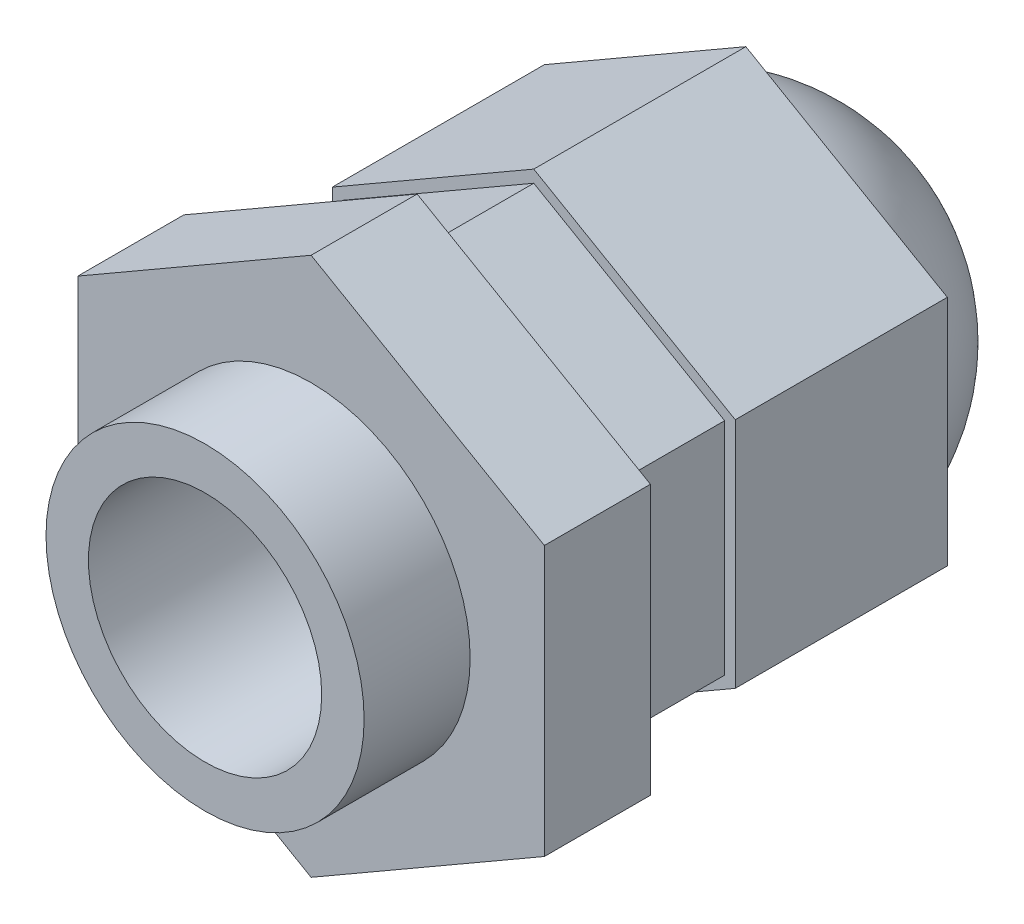
ISO-10303-21;
HEADER;
FILE_DESCRIPTION(('STEP AP214'),'2;1');
FILE_NAME('part.step','',(''),(''),'','','');
FILE_SCHEMA(('AUTOMOTIVE_DESIGN { 1 0 10303 214 1 1 1 1 }'));
ENDSEC;
DATA;
#1=APPLICATION_CONTEXT('core data for automotive mechanical design processes');
#2=APPLICATION_PROTOCOL_DEFINITION('international standard','automotive_design',2000,#1);
#3=PRODUCT_CONTEXT('',#1,'mechanical');
#4=PRODUCT('Part','Part','',(#3));
#5=PRODUCT_RELATED_PRODUCT_CATEGORY('part','',(#4));
#6=PRODUCT_DEFINITION_FORMATION('','',#4);
#7=PRODUCT_DEFINITION_CONTEXT('part definition',#1,'design');
#8=PRODUCT_DEFINITION('design','',#6,#7);
#9=PRODUCT_DEFINITION_SHAPE('','',#8);
#10=(LENGTH_UNIT() NAMED_UNIT(*) SI_UNIT(.MILLI.,.METRE.));
#11=(NAMED_UNIT(*) PLANE_ANGLE_UNIT() SI_UNIT($,.RADIAN.));
#12=(NAMED_UNIT(*) SI_UNIT($,.STERADIAN.) SOLID_ANGLE_UNIT());
#13=UNCERTAINTY_MEASURE_WITH_UNIT(LENGTH_MEASURE(1.E-05),#10,'distance_accuracy_value','');
#14=(GEOMETRIC_REPRESENTATION_CONTEXT(3) GLOBAL_UNCERTAINTY_ASSIGNED_CONTEXT((#13)) GLOBAL_UNIT_ASSIGNED_CONTEXT((#10,
#11,#12)) REPRESENTATION_CONTEXT('',''));
#15=CARTESIAN_POINT('',(0.,0.,0.));
#16=DIRECTION('',(0.,0.,1.));
#17=DIRECTION('',(1.,0.,0.));
#18=AXIS2_PLACEMENT_3D('',#15,#16,#17);
#19=CARTESIAN_POINT('',(0.,0.,-23.3142857142857));
#20=DIRECTION('',(0.,0.,1.));
#21=DIRECTION('',(1.,0.,0.));
#22=AXIS2_PLACEMENT_3D('',#19,#20,#21);
#23=SPHERICAL_SURFACE('',#22,9.28571428571428);
#24=CARTESIAN_POINT('',(0.,0.,-25.6));
#25=DIRECTION('',(0.,0.,-1.));
#26=DIRECTION('',(-1.,0.,0.));
#27=AXIS2_PLACEMENT_3D('',#24,#25,#26);
#28=CIRCLE('',#27,9.);
#29=CARTESIAN_POINT('',(9.,0.,-25.6));
#30=VERTEX_POINT('',#29);
#31=EDGE_CURVE('E151',#30,#30,#28,.T.);
#32=CARTESIAN_POINT('',(0.,0.,-31.));
#33=DIRECTION('',(0.,0.,-1.));
#34=DIRECTION('',(-1.,0.,0.));
#35=AXIS2_PLACEMENT_3D('',#32,#33,#34);
#36=CIRCLE('',#35,5.21097742408138);
#37=CARTESIAN_POINT('',(5.21097742408138,0.,-31.));
#38=VERTEX_POINT('',#37);
#39=EDGE_CURVE('E313',#38,#38,#36,.F.);
#40=CARTESIAN_POINT('',(9.,0.,-25.6));
#41=CARTESIAN_POINT('',(8.98270792926875,0.,-25.6680881274408));
#42=CARTESIAN_POINT('',(8.96464291467511,0.,-25.7359799456978));
#43=CARTESIAN_POINT('',(8.92697692679167,0.,-25.8713361672399));
#44=CARTESIAN_POINT('',(8.90737595350187,0.,-25.9388005705249));
#45=CARTESIAN_POINT('',(8.86664797725476,0.,-26.0732671655184));
#46=CARTESIAN_POINT('',(8.84552097429744,0.,-26.1402693572269));
#47=CARTESIAN_POINT('',(8.80175186577183,0.,-26.273777029533));
#48=CARTESIAN_POINT('',(8.77910976020353,0.,-26.3402825101306));
#49=CARTESIAN_POINT('',(8.73232209712088,0.,-26.4727625007238));
#50=CARTESIAN_POINT('',(8.70817653960652,0.,-26.5387370107194));
#51=CARTESIAN_POINT('',(8.65839441292628,0.,-26.6701210783492));
#52=CARTESIAN_POINT('',(8.6327578437604,0.,-26.7355306359834));
#53=CARTESIAN_POINT('',(8.5800068979951,0.,-26.8657511069961));
#54=CARTESIAN_POINT('',(8.55289252139569,0.,-26.9305620203746));
#55=CARTESIAN_POINT('',(8.49719992727441,0.,-27.05955181964));
#56=CARTESIAN_POINT('',(8.46862170975255,0.,-27.1237307055269));
#57=CARTESIAN_POINT('',(8.41001615401102,0.,-27.2514233920412));
#58=CARTESIAN_POINT('',(8.37998881579135,0.,-27.3149371926687));
#59=CARTESIAN_POINT('',(8.31850048538145,0.,-27.4412669934953));
#60=CARTESIAN_POINT('',(8.28703949319123,0.,-27.5040829936944));
#61=CARTESIAN_POINT('',(8.22270006000389,0.,-27.6289848379181));
#62=CARTESIAN_POINT('',(8.18982161900678,0.,-27.6910706819426));
#63=CARTESIAN_POINT('',(8.12266422348532,0.,-27.8144802341667));
#64=CARTESIAN_POINT('',(8.08838526896097,0.,-27.8758039423663));
#65=CARTESIAN_POINT('',(8.01844450305039,0.,-27.9976576358565));
#66=CARTESIAN_POINT('',(7.98278269166416,0.,-28.0581876211472));
#67=CARTESIAN_POINT('',(7.91009458098803,0.,-28.1784226905725));
#68=CARTESIAN_POINT('',(7.87306828169814,0.,-28.2381277747072));
#69=CARTESIAN_POINT('',(7.79767026700366,0.,-28.3566822884698));
#70=CARTESIAN_POINT('',(7.75929855159907,0.,-28.4155317180978));
#71=CARTESIAN_POINT('',(7.6812294694714,0.,-28.5323446102336));
#72=CARTESIAN_POINT('',(7.64153210274833,0.,-28.5903080727413));
#73=CARTESIAN_POINT('',(7.56083216560647,0.,-28.7053191743736));
#74=CARTESIAN_POINT('',(7.51982959518769,0.,-28.7623668134982));
#75=CARTESIAN_POINT('',(7.43654037057153,0.,-28.8755168838305));
#76=CARTESIAN_POINT('',(7.39425371637415,0.,-28.9316193150383));
#77=CARTESIAN_POINT('',(7.30841810553353,0.,-29.0428500718684));
#78=CARTESIAN_POINT('',(7.26486914889031,0.,-29.0979783974907));
#79=CARTESIAN_POINT('',(7.17653136468716,0.,-29.2072325472309));
#80=CARTESIAN_POINT('',(7.13174253712725,0.,-29.2613583713488));
#81=CARTESIAN_POINT('',(7.04094808126202,0.,-29.3685796385373));
#82=CARTESIAN_POINT('',(6.9949424529567,0.,-29.4216750816079));
#83=CARTESIAN_POINT('',(6.90173809253119,0.,-29.5268082378957));
#84=CARTESIAN_POINT('',(6.85453936041101,0.,-29.578845951113));
#85=CARTESIAN_POINT('',(6.75897310383843,0.,-29.6818368437106));
#86=CARTESIAN_POINT('',(6.71060557938603,0.,-29.7327900230909));
#87=CARTESIAN_POINT('',(6.61272665166556,0.,-29.8335856026654));
#88=CARTESIAN_POINT('',(6.56321524839748,0.,-29.8834280028597));
#89=CARTESIAN_POINT('',(6.46307406574734,0.,-29.9819763508441));
#90=CARTESIAN_POINT('',(6.41244428636529,0.,-30.0306822986343));
#91=CARTESIAN_POINT('',(6.31009243029785,0.,-30.1269326540312));
#92=CARTESIAN_POINT('',(6.25837035361246,0.,-30.174477061638));
#93=CARTESIAN_POINT('',(6.15386054420159,0.,-30.2683798469365));
#94=CARTESIAN_POINT('',(6.10107281147612,0.,-30.3147382246281));
#95=CARTESIAN_POINT('',(5.99445888081226,0.,-30.4062450721979));
#96=CARTESIAN_POINT('',(5.94063268287387,0.,-30.451393542076));
#97=CARTESIAN_POINT('',(5.83196954505749,0.,-30.5404573158799));
#98=CARTESIAN_POINT('',(5.77713260517948,0.,-30.5843726198058));
#99=CARTESIAN_POINT('',(5.66647623653807,0.,-30.6709474516267));
#100=CARTESIAN_POINT('',(5.61065680777467,0.,-30.7136069795217));
#101=CARTESIAN_POINT('',(5.498064186298,0.,-30.7976482479995));
#102=CARTESIAN_POINT('',(5.44129099358474,0.,-30.8390299885822));
#103=CARTESIAN_POINT('',(5.32682018800191,0.,-30.9204945086053));
#104=CARTESIAN_POINT('',(5.26912257513233,0.,-30.9605772880457));
#105=CARTESIAN_POINT('',(5.21097742408138,0.,-31.));
#106=B_SPLINE_CURVE_WITH_KNOTS('',3,(#40,#41,#42,#43,#44,#45,#46,#47,#48,#49,#50,#51,#52,#53,
#54,#55,#56,#57,#58,#59,#60,#61,#62,#63,#64,#65,#66,#67,#68,#69,#70,#71,#72,#73,#74,#75,#76,#77,
#78,#79,#80,#81,#82,#83,#84,#85,#86,#87,#88,#89,#90,#91,#92,#93,#94,#95,#96,#97,#98,#99,#100,
#101,#102,#103,#104,#105),.UNSPECIFIED.,.F.,.F.,(4,2,2,2,2,2,2,2,2,2,2,2,2,2,2,2,2,2,2,2,2,2,2,
2,2,2,2,2,2,2,2,2,4),(0.,0.210744320577327,0.421488641154651,0.632232961731976,
0.842977282309298,1.05372160288662,1.26446592346395,1.47521024404127,1.6859545646186,
1.89669888519592,2.10744320577325,2.31818752635057,2.52893184692789,2.73967616750522,
2.95042048808254,3.16116480865987,3.37190912923719,3.58265344981452,3.79339777039184,
4.00414209096917,4.21488641154649,4.42563073212381,4.63637505270114,4.84711937327846,
5.05786369385579,5.26860801443311,5.47935233501044,5.69009665558776,5.90084097616509,
6.11158529674241,6.32232961731973,6.53307393789706,6.74381825847439),.UNSPECIFIED.);
#107=EDGE_CURVE('BSEAM35',#30,#38,#106,.T.);
#108=ORIENTED_EDGE('',*,*,#31,.T.);
#109=ORIENTED_EDGE('',*,*,#39,.T.);
#110=ORIENTED_EDGE('',*,*,#107,.T.);
#111=ORIENTED_EDGE('',*,*,#107,.F.);
#112=EDGE_LOOP('',(#108,#110,#109,#111));
#113=FACE_BOUND('',#112,.T.);
#114=ADVANCED_FACE('F35',(#113),#23,.T.);
#115=CARTESIAN_POINT('',(0.,0.,-44.5));
#116=DIRECTION('',(0.,0.,1.));
#117=DIRECTION('',(1.,0.,0.));
#118=AXIS2_PLACEMENT_3D('',#115,#116,#117);
#119=CYLINDRICAL_SURFACE('',#118,4.);
#120=CARTESIAN_POINT('',(0.,0.,-24.5));
#121=DIRECTION('',(0.,0.,1.));
#122=DIRECTION('',(1.,0.,0.));
#123=AXIS2_PLACEMENT_3D('',#120,#121,#122);
#124=CIRCLE('',#123,4.);
#125=CARTESIAN_POINT('',(4.,0.,-24.5));
#126=VERTEX_POINT('',#125);
#127=EDGE_CURVE('E166',#126,#126,#124,.T.);
#128=ORIENTED_EDGE('',*,*,#127,.T.);
#129=EDGE_LOOP('',(#128));
#130=FACE_BOUND('',#129,.T.);
#131=CARTESIAN_POINT('',(0.,0.,-31.));
#132=DIRECTION('',(0.,0.,-1.));
#133=DIRECTION('',(-1.,0.,0.));
#134=AXIS2_PLACEMENT_3D('',#131,#132,#133);
#135=CIRCLE('',#134,4.);
#136=CARTESIAN_POINT('',(-4.,0.,-31.));
#137=VERTEX_POINT('',#136);
#138=EDGE_CURVE('E38',#137,#137,#135,.F.);
#139=ORIENTED_EDGE('',*,*,#138,.F.);
#140=EDGE_LOOP('',(#139));
#141=FACE_BOUND('',#140,.T.);
#142=ADVANCED_FACE('F303',(#130,#141),#119,.F.);
#143=CARTESIAN_POINT('',(-9.5,5.48482755730145,-25.5));
#144=DIRECTION('',(0.,0.,1.));
#145=DIRECTION('',(1.,0.,0.));
#146=AXIS2_PLACEMENT_3D('',#143,#144,#145);
#147=PLANE('',#146);
#148=DIRECTION('',(0.866025403784439,0.5,0.));
#149=VECTOR('',#148,1.);
#150=CARTESIAN_POINT('',(-9.5,5.48482755730145,-25.5));
#151=LINE('',#150,#149);
#152=CARTESIAN_POINT('',(-9.5,5.48482755730145,-25.5));
#153=VERTEX_POINT('',#152);
#154=CARTESIAN_POINT('',(0.,10.9696551146029,-25.5));
#155=VERTEX_POINT('',#154);
#156=EDGE_CURVE('E170',#153,#155,#151,.T.);
#157=ORIENTED_EDGE('',*,*,#156,.T.);
#158=DIRECTION('',(0.866025403784439,-0.5,0.));
#159=VECTOR('',#158,1.);
#160=CARTESIAN_POINT('',(0.,10.9696551146029,-25.5));
#161=LINE('',#160,#159);
#162=CARTESIAN_POINT('',(9.5,5.48482755730145,-25.5));
#163=VERTEX_POINT('',#162);
#164=EDGE_CURVE('E173',#155,#163,#161,.T.);
#165=ORIENTED_EDGE('',*,*,#164,.T.);
#166=DIRECTION('',(0.,-1.,0.));
#167=VECTOR('',#166,1.);
#168=CARTESIAN_POINT('',(9.5,5.48482755730145,-25.5));
#169=LINE('',#168,#167);
#170=CARTESIAN_POINT('',(9.5,-5.48482755730145,-25.5));
#171=VERTEX_POINT('',#170);
#172=EDGE_CURVE('E177',#163,#171,#169,.T.);
#173=ORIENTED_EDGE('',*,*,#172,.T.);
#174=DIRECTION('',(-0.866025403784439,-0.5,0.));
#175=VECTOR('',#174,1.);
#176=CARTESIAN_POINT('',(9.5,-5.48482755730145,-25.5));
#177=LINE('',#176,#175);
#178=CARTESIAN_POINT('',(0.,-10.9696551146029,-25.5));
#179=VERTEX_POINT('',#178);
#180=EDGE_CURVE('E180',#171,#179,#177,.T.);
#181=ORIENTED_EDGE('',*,*,#180,.T.);
#182=DIRECTION('',(-0.866025403784439,0.5,0.));
#183=VECTOR('',#182,1.);
#184=CARTESIAN_POINT('',(0.,-10.9696551146029,-25.5));
#185=LINE('',#184,#183);
#186=CARTESIAN_POINT('',(-9.5,-5.48482755730145,-25.5));
#187=VERTEX_POINT('',#186);
#188=EDGE_CURVE('E183',#179,#187,#185,.T.);
#189=ORIENTED_EDGE('',*,*,#188,.T.);
#190=DIRECTION('',(0.,1.,0.));
#191=VECTOR('',#190,1.);
#192=CARTESIAN_POINT('',(-9.5,-5.48482755730145,-25.5));
#193=LINE('',#192,#191);
#194=EDGE_CURVE('E186',#187,#153,#193,.T.);
#195=ORIENTED_EDGE('',*,*,#194,.T.);
#196=EDGE_LOOP('',(#157,#165,#173,#181,#189,#195));
#197=FACE_BOUND('',#196,.T.);
#198=CARTESIAN_POINT('',(0.,0.,-25.5));
#199=DIRECTION('',(0.,0.,1.));
#200=DIRECTION('',(1.,0.,0.));
#201=AXIS2_PLACEMENT_3D('',#198,#199,#200);
#202=CIRCLE('',#201,9.);
#203=CARTESIAN_POINT('',(9.,0.,-25.5));
#204=VERTEX_POINT('',#203);
#205=EDGE_CURVE('E12',#204,#204,#202,.F.);
#206=ORIENTED_EDGE('',*,*,#205,.F.);
#207=EDGE_LOOP('',(#206));
#208=FACE_BOUND('',#207,.T.);
#209=ADVANCED_FACE('F307',(#197,#208),#147,.F.);
#210=CARTESIAN_POINT('',(11.,19.0525588832577,-10.));
#211=DIRECTION('',(0.,0.,-1.));
#212=DIRECTION('',(-1.,0.,0.));
#213=AXIS2_PLACEMENT_3D('',#210,#211,#212);
#214=PLANE('',#213);
#215=DIRECTION('',(0.866025403784439,0.5,0.));
#216=VECTOR('',#215,1.);
#217=CARTESIAN_POINT('',(-11.,6.35085296108589,-10.));
#218=LINE('',#217,#216);
#219=CARTESIAN_POINT('',(-11.,6.35085296108589,-10.));
#220=VERTEX_POINT('',#219);
#221=CARTESIAN_POINT('',(0.,12.7017059221718,-10.));
#222=VERTEX_POINT('',#221);
#223=EDGE_CURVE('E138',#220,#222,#218,.T.);
#224=ORIENTED_EDGE('',*,*,#223,.T.);
#225=DIRECTION('',(0.866025403784439,-0.5,0.));
#226=VECTOR('',#225,1.);
#227=CARTESIAN_POINT('',(0.,12.7017059221718,-10.));
#228=LINE('',#227,#226);
#229=CARTESIAN_POINT('',(11.,6.35085296108589,-10.));
#230=VERTEX_POINT('',#229);
#231=EDGE_CURVE('E92',#222,#230,#228,.T.);
#232=ORIENTED_EDGE('',*,*,#231,.T.);
#233=DIRECTION('',(0.,-1.,0.));
#234=VECTOR('',#233,1.);
#235=CARTESIAN_POINT('',(11.,6.35085296108589,-10.));
#236=LINE('',#235,#234);
#237=CARTESIAN_POINT('',(11.,-6.35085296108588,-10.));
#238=VERTEX_POINT('',#237);
#239=EDGE_CURVE('E109',#230,#238,#236,.T.);
#240=ORIENTED_EDGE('',*,*,#239,.T.);
#241=DIRECTION('',(-0.866025403784439,-0.5,0.));
#242=VECTOR('',#241,1.);
#243=CARTESIAN_POINT('',(11.,-6.35085296108588,-10.));
#244=LINE('',#243,#242);
#245=CARTESIAN_POINT('',(0.,-12.7017059221718,-10.));
#246=VERTEX_POINT('',#245);
#247=EDGE_CURVE('E102',#238,#246,#244,.T.);
#248=ORIENTED_EDGE('',*,*,#247,.T.);
#249=DIRECTION('',(-0.866025403784439,0.5,0.));
#250=VECTOR('',#249,1.);
#251=CARTESIAN_POINT('',(0.,-12.7017059221718,-10.));
#252=LINE('',#251,#250);
#253=CARTESIAN_POINT('',(-11.,-6.35085296108589,-10.));
#254=VERTEX_POINT('',#253);
#255=EDGE_CURVE('E107',#246,#254,#252,.T.);
#256=ORIENTED_EDGE('',*,*,#255,.T.);
#257=DIRECTION('',(0.,1.,0.));
#258=VECTOR('',#257,1.);
#259=CARTESIAN_POINT('',(-11.,-6.35085296108589,-10.));
#260=LINE('',#259,#258);
#261=EDGE_CURVE('E53',#254,#220,#260,.T.);
#262=ORIENTED_EDGE('',*,*,#261,.T.);
#263=EDGE_LOOP('',(#224,#232,#240,#248,#256,#262));
#264=FACE_BOUND('',#263,.T.);
#265=CARTESIAN_POINT('',(0.,0.,-10.));
#266=DIRECTION('',(0.,0.,-1.));
#267=DIRECTION('',(-1.,0.,0.));
#268=AXIS2_PLACEMENT_3D('',#265,#266,#267);
#269=CIRCLE('',#268,7.5);
#270=CARTESIAN_POINT('',(-7.5,0.,-10.));
#271=VERTEX_POINT('',#270);
#272=EDGE_CURVE('E274',#271,#271,#269,.T.);
#273=ORIENTED_EDGE('',*,*,#272,.F.);
#274=EDGE_LOOP('',(#273));
#275=FACE_BOUND('',#274,.T.);
#276=ADVANCED_FACE('F104',(#264,#275),#214,.T.);
#277=CARTESIAN_POINT('',(0.,0.,-5.));
#278=DIRECTION('',(0.,0.,1.));
#279=DIRECTION('',(1.,0.,0.));
#280=AXIS2_PLACEMENT_3D('',#277,#278,#279);
#281=CYLINDRICAL_SURFACE('',#280,7.5);
#282=CARTESIAN_POINT('',(0.,0.,-5.));
#283=DIRECTION('',(0.,0.,-1.));
#284=DIRECTION('',(-1.,0.,0.));
#285=AXIS2_PLACEMENT_3D('',#282,#283,#284);
#286=CIRCLE('',#285,7.5);
#287=CARTESIAN_POINT('',(-7.5,0.,-5.));
#288=VERTEX_POINT('',#287);
#289=EDGE_CURVE('E147',#288,#288,#286,.F.);
#290=ORIENTED_EDGE('',*,*,#289,.T.);
#291=EDGE_LOOP('',(#290));
#292=FACE_BOUND('',#291,.T.);
#293=CARTESIAN_POINT('',(0.,0.,0.));
#294=DIRECTION('',(0.,0.,1.));
#295=DIRECTION('',(1.,0.,0.));
#296=AXIS2_PLACEMENT_3D('',#293,#294,#295);
#297=CIRCLE('',#296,7.5);
#298=CARTESIAN_POINT('',(7.5,0.,0.));
#299=VERTEX_POINT('',#298);
#300=EDGE_CURVE('E44',#299,#299,#297,.T.);
#301=ORIENTED_EDGE('',*,*,#300,.F.);
#302=EDGE_LOOP('',(#301));
#303=FACE_BOUND('',#302,.T.);
#304=ADVANCED_FACE('F401',(#292,#303),#281,.T.);
#305=CARTESIAN_POINT('',(0.,0.,0.));
#306=DIRECTION('',(0.,0.,1.));
#307=DIRECTION('',(1.,0.,0.));
#308=AXIS2_PLACEMENT_3D('',#305,#306,#307);
#309=PLANE('',#308);
#310=CARTESIAN_POINT('',(0.,0.,0.));
#311=DIRECTION('',(0.,0.,1.));
#312=DIRECTION('',(1.,0.,0.));
#313=AXIS2_PLACEMENT_3D('',#310,#311,#312);
#314=CIRCLE('',#313,5.5);
#315=CARTESIAN_POINT('',(5.5,0.,0.));
#316=VERTEX_POINT('',#315);
#317=EDGE_CURVE('E161',#316,#316,#314,.T.);
#318=ORIENTED_EDGE('',*,*,#317,.F.);
#319=EDGE_LOOP('',(#318));
#320=FACE_BOUND('',#319,.T.);
#321=ORIENTED_EDGE('',*,*,#300,.T.);
#322=EDGE_LOOP('',(#321));
#323=FACE_BOUND('',#322,.T.);
#324=ADVANCED_FACE('F405',(#320,#323),#309,.T.);
#325=CARTESIAN_POINT('',(-11.,6.35085296108589,-10.));
#326=DIRECTION('',(0.5,-0.866025403784439,0.));
#327=DIRECTION('',(0.866025403784439,0.5,0.));
#328=AXIS2_PLACEMENT_3D('',#325,#326,#327);
#329=PLANE('',#328);
#330=DIRECTION('',(0.866025403784439,0.5,0.));
#331=VECTOR('',#330,1.);
#332=CARTESIAN_POINT('',(-11.,6.35085296108589,-5.));
#333=LINE('',#332,#331);
#334=CARTESIAN_POINT('',(-11.,6.35085296108589,-5.));
#335=VERTEX_POINT('',#334);
#336=CARTESIAN_POINT('',(0.,12.7017059221718,-5.));
#337=VERTEX_POINT('',#336);
#338=EDGE_CURVE('E127',#335,#337,#333,.T.);
#339=ORIENTED_EDGE('',*,*,#338,.T.);
#340=DIRECTION('',(0.,0.,1.));
#341=VECTOR('',#340,1.);
#342=CARTESIAN_POINT('',(0.,12.7017059221718,-10.));
#343=LINE('',#342,#341);
#344=EDGE_CURVE('E145',#222,#337,#343,.T.);
#345=ORIENTED_EDGE('',*,*,#344,.F.);
#346=ORIENTED_EDGE('',*,*,#223,.F.);
#347=DIRECTION('',(0.,0.,1.));
#348=VECTOR('',#347,1.);
#349=CARTESIAN_POINT('',(-11.,6.35085296108589,-10.));
#350=LINE('',#349,#348);
#351=EDGE_CURVE('E123',#220,#335,#350,.T.);
#352=ORIENTED_EDGE('',*,*,#351,.T.);
#353=EDGE_LOOP('',(#339,#345,#346,#352));
#354=FACE_BOUND('',#353,.T.);
#355=ADVANCED_FACE('F290',(#354),#329,.F.);
#356=CARTESIAN_POINT('',(0.,12.7017059221718,-10.));
#357=DIRECTION('',(-0.5,-0.866025403784439,0.));
#358=DIRECTION('',(0.866025403784439,-0.5,0.));
#359=AXIS2_PLACEMENT_3D('',#356,#357,#358);
#360=PLANE('',#359);
#361=DIRECTION('',(0.866025403784439,-0.5,0.));
#362=VECTOR('',#361,1.);
#363=CARTESIAN_POINT('',(0.,12.7017059221718,-5.));
#364=LINE('',#363,#362);
#365=CARTESIAN_POINT('',(11.,6.35085296108589,-5.));
#366=VERTEX_POINT('',#365);
#367=EDGE_CURVE('E130',#337,#366,#364,.T.);
#368=ORIENTED_EDGE('',*,*,#367,.T.);
#369=DIRECTION('',(0.,0.,1.));
#370=VECTOR('',#369,1.);
#371=CARTESIAN_POINT('',(11.,6.35085296108589,-10.));
#372=LINE('',#371,#370);
#373=EDGE_CURVE('E142',#230,#366,#372,.T.);
#374=ORIENTED_EDGE('',*,*,#373,.F.);
#375=ORIENTED_EDGE('',*,*,#231,.F.);
#376=ORIENTED_EDGE('',*,*,#344,.T.);
#377=EDGE_LOOP('',(#368,#374,#375,#376));
#378=FACE_BOUND('',#377,.T.);
#379=ADVANCED_FACE('F282',(#378),#360,.F.);
#380=CARTESIAN_POINT('',(11.,6.35085296108589,-10.));
#381=DIRECTION('',(-1.,0.,0.));
#382=DIRECTION('',(0.,0.,1.));
#383=AXIS2_PLACEMENT_3D('',#380,#381,#382);
#384=PLANE('',#383);
#385=DIRECTION('',(0.,-1.,0.));
#386=VECTOR('',#385,1.);
#387=CARTESIAN_POINT('',(11.,6.35085296108589,-5.));
#388=LINE('',#387,#386);
#389=CARTESIAN_POINT('',(11.,-6.35085296108588,-5.));
#390=VERTEX_POINT('',#389);
#391=EDGE_CURVE('E133',#366,#390,#388,.T.);
#392=ORIENTED_EDGE('',*,*,#391,.T.);
#393=DIRECTION('',(0.,0.,1.));
#394=VECTOR('',#393,1.);
#395=CARTESIAN_POINT('',(11.,-6.35085296108588,-10.));
#396=LINE('',#395,#394);
#397=EDGE_CURVE('E118',#238,#390,#396,.T.);
#398=ORIENTED_EDGE('',*,*,#397,.F.);
#399=ORIENTED_EDGE('',*,*,#239,.F.);
#400=ORIENTED_EDGE('',*,*,#373,.T.);
#401=EDGE_LOOP('',(#392,#398,#399,#400));
#402=FACE_BOUND('',#401,.T.);
#403=ADVANCED_FACE('F285',(#402),#384,.F.);
#404=CARTESIAN_POINT('',(11.,-6.35085296108588,-10.));
#405=DIRECTION('',(-0.5,0.866025403784439,0.));
#406=DIRECTION('',(-0.866025403784439,-0.5,0.));
#407=AXIS2_PLACEMENT_3D('',#404,#405,#406);
#408=PLANE('',#407);
#409=DIRECTION('',(-0.866025403784439,-0.5,0.));
#410=VECTOR('',#409,1.);
#411=CARTESIAN_POINT('',(11.,-6.35085296108588,-5.));
#412=LINE('',#411,#410);
#413=CARTESIAN_POINT('',(0.,-12.7017059221718,-5.));
#414=VERTEX_POINT('',#413);
#415=EDGE_CURVE('E117',#390,#414,#412,.T.);
#416=ORIENTED_EDGE('',*,*,#415,.T.);
#417=DIRECTION('',(0.,0.,1.));
#418=VECTOR('',#417,1.);
#419=CARTESIAN_POINT('',(0.,-12.7017059221718,-10.));
#420=LINE('',#419,#418);
#421=EDGE_CURVE('E114',#246,#414,#420,.T.);
#422=ORIENTED_EDGE('',*,*,#421,.F.);
#423=ORIENTED_EDGE('',*,*,#247,.F.);
#424=ORIENTED_EDGE('',*,*,#397,.T.);
#425=EDGE_LOOP('',(#416,#422,#423,#424));
#426=FACE_BOUND('',#425,.T.);
#427=ADVANCED_FACE('F115',(#426),#408,.F.);
#428=CARTESIAN_POINT('',(0.,-12.7017059221718,-10.));
#429=DIRECTION('',(0.5,0.866025403784439,0.));
#430=DIRECTION('',(-0.866025403784439,0.5,0.));
#431=AXIS2_PLACEMENT_3D('',#428,#429,#430);
#432=PLANE('',#431);
#433=DIRECTION('',(-0.866025403784439,0.5,0.));
#434=VECTOR('',#433,1.);
#435=CARTESIAN_POINT('',(0.,-12.7017059221718,-5.));
#436=LINE('',#435,#434);
#437=CARTESIAN_POINT('',(-11.,-6.35085296108589,-5.));
#438=VERTEX_POINT('',#437);
#439=EDGE_CURVE('E77',#414,#438,#436,.T.);
#440=ORIENTED_EDGE('',*,*,#439,.T.);
#441=DIRECTION('',(0.,0.,1.));
#442=VECTOR('',#441,1.);
#443=CARTESIAN_POINT('',(-11.,-6.35085296108589,-10.));
#444=LINE('',#443,#442);
#445=EDGE_CURVE('E119',#254,#438,#444,.T.);
#446=ORIENTED_EDGE('',*,*,#445,.F.);
#447=ORIENTED_EDGE('',*,*,#255,.F.);
#448=ORIENTED_EDGE('',*,*,#421,.T.);
#449=EDGE_LOOP('',(#440,#446,#447,#448));
#450=FACE_BOUND('',#449,.T.);
#451=ADVANCED_FACE('F121',(#450),#432,.F.);
#452=CARTESIAN_POINT('',(-11.,-6.35085296108589,-10.));
#453=DIRECTION('',(1.,0.,0.));
#454=DIRECTION('',(0.,1.,0.));
#455=AXIS2_PLACEMENT_3D('',#452,#453,#454);
#456=PLANE('',#455);
#457=DIRECTION('',(0.,1.,0.));
#458=VECTOR('',#457,1.);
#459=CARTESIAN_POINT('',(-11.,-6.35085296108589,-5.));
#460=LINE('',#459,#458);
#461=EDGE_CURVE('E83',#438,#335,#460,.T.);
#462=ORIENTED_EDGE('',*,*,#461,.T.);
#463=ORIENTED_EDGE('',*,*,#351,.F.);
#464=ORIENTED_EDGE('',*,*,#261,.F.);
#465=ORIENTED_EDGE('',*,*,#445,.T.);
#466=EDGE_LOOP('',(#462,#463,#464,#465));
#467=FACE_BOUND('',#466,.T.);
#468=ADVANCED_FACE('F291',(#467),#456,.F.);
#469=CARTESIAN_POINT('',(11.,19.0525588832577,-5.));
#470=DIRECTION('',(0.,0.,-1.));
#471=DIRECTION('',(-1.,0.,0.));
#472=AXIS2_PLACEMENT_3D('',#469,#470,#471);
#473=PLANE('',#472);
#474=ORIENTED_EDGE('',*,*,#289,.F.);
#475=EDGE_LOOP('',(#474));
#476=FACE_BOUND('',#475,.T.);
#477=ORIENTED_EDGE('',*,*,#338,.F.);
#478=ORIENTED_EDGE('',*,*,#461,.F.);
#479=ORIENTED_EDGE('',*,*,#439,.F.);
#480=ORIENTED_EDGE('',*,*,#415,.F.);
#481=ORIENTED_EDGE('',*,*,#391,.F.);
#482=ORIENTED_EDGE('',*,*,#367,.F.);
#483=EDGE_LOOP('',(#477,#478,#479,#480,#481,#482));
#484=FACE_BOUND('',#483,.T.);
#485=ADVANCED_FACE('F288',(#476,#484),#473,.F.);
#486=CARTESIAN_POINT('',(0.,0.,-11.));
#487=DIRECTION('',(0.,0.,1.));
#488=DIRECTION('',(1.,0.,0.));
#489=AXIS2_PLACEMENT_3D('',#486,#487,#488);
#490=CYLINDRICAL_SURFACE('',#489,7.5);
#491=CARTESIAN_POINT('',(0.,0.,-11.));
#492=DIRECTION('',(0.,0.,-1.));
#493=DIRECTION('',(-1.,0.,0.));
#494=AXIS2_PLACEMENT_3D('',#491,#492,#493);
#495=CIRCLE('',#494,7.5);
#496=CARTESIAN_POINT('',(-7.5,0.,-11.));
#497=VERTEX_POINT('',#496);
#498=EDGE_CURVE('E131',#497,#497,#495,.T.);
#499=ORIENTED_EDGE('',*,*,#498,.F.);
#500=EDGE_LOOP('',(#499));
#501=FACE_BOUND('',#500,.T.);
#502=ORIENTED_EDGE('',*,*,#272,.T.);
#503=EDGE_LOOP('',(#502));
#504=FACE_BOUND('',#503,.T.);
#505=ADVANCED_FACE('F298',(#501,#504),#490,.T.);
#506=CARTESIAN_POINT('',(9.,15.5884572681199,-11.));
#507=DIRECTION('',(0.,0.,-1.));
#508=DIRECTION('',(-1.,0.,0.));
#509=AXIS2_PLACEMENT_3D('',#506,#507,#508);
#510=PLANE('',#509);
#511=DIRECTION('',(0.866025403784439,0.5,0.));
#512=VECTOR('',#511,1.);
#513=CARTESIAN_POINT('',(-9.,5.19615242270664,-11.));
#514=LINE('',#513,#512);
#515=CARTESIAN_POINT('',(-9.,5.19615242270664,-11.));
#516=VERTEX_POINT('',#515);
#517=CARTESIAN_POINT('',(0.,10.3923048454133,-11.));
#518=VERTEX_POINT('',#517);
#519=EDGE_CURVE('E220',#516,#518,#514,.T.);
#520=ORIENTED_EDGE('',*,*,#519,.F.);
#521=DIRECTION('',(0.,1.,0.));
#522=VECTOR('',#521,1.);
#523=CARTESIAN_POINT('',(-9.,-5.19615242270663,-11.));
#524=LINE('',#523,#522);
#525=CARTESIAN_POINT('',(-9.,-5.19615242270663,-11.));
#526=VERTEX_POINT('',#525);
#527=EDGE_CURVE('E225',#526,#516,#524,.T.);
#528=ORIENTED_EDGE('',*,*,#527,.F.);
#529=DIRECTION('',(-0.866025403784439,0.5,0.));
#530=VECTOR('',#529,1.);
#531=CARTESIAN_POINT('',(0.,-10.3923048454133,-11.));
#532=LINE('',#531,#530);
#533=CARTESIAN_POINT('',(0.,-10.3923048454133,-11.));
#534=VERTEX_POINT('',#533);
#535=EDGE_CURVE('E252',#534,#526,#532,.T.);
#536=ORIENTED_EDGE('',*,*,#535,.F.);
#537=DIRECTION('',(-0.866025403784438,-0.5,0.));
#538=VECTOR('',#537,1.);
#539=CARTESIAN_POINT('',(9.,-5.19615242270663,-11.));
#540=LINE('',#539,#538);
#541=CARTESIAN_POINT('',(9.,-5.19615242270663,-11.));
#542=VERTEX_POINT('',#541);
#543=EDGE_CURVE('E249',#542,#534,#540,.T.);
#544=ORIENTED_EDGE('',*,*,#543,.F.);
#545=DIRECTION('',(0.,-1.,0.));
#546=VECTOR('',#545,1.);
#547=CARTESIAN_POINT('',(9.,5.19615242270664,-11.));
#548=LINE('',#547,#546);
#549=CARTESIAN_POINT('',(9.,5.19615242270664,-11.));
#550=VERTEX_POINT('',#549);
#551=EDGE_CURVE('E246',#550,#542,#548,.T.);
#552=ORIENTED_EDGE('',*,*,#551,.F.);
#553=DIRECTION('',(0.866025403784439,-0.5,0.));
#554=VECTOR('',#553,1.);
#555=CARTESIAN_POINT('',(0.,10.3923048454133,-11.));
#556=LINE('',#555,#554);
#557=EDGE_CURVE('E243',#518,#550,#556,.T.);
#558=ORIENTED_EDGE('',*,*,#557,.F.);
#559=EDGE_LOOP('',(#520,#528,#536,#544,#552,#558));
#560=FACE_BOUND('',#559,.T.);
#561=ORIENTED_EDGE('',*,*,#498,.T.);
#562=EDGE_LOOP('',(#561));
#563=FACE_BOUND('',#562,.T.);
#564=ADVANCED_FACE('F370',(#560,#563),#510,.F.);
#565=CARTESIAN_POINT('',(-9.,5.19615242270664,-15.5));
#566=DIRECTION('',(0.5,-0.866025403784439,0.));
#567=DIRECTION('',(0.866025403784439,0.5,0.));
#568=AXIS2_PLACEMENT_3D('',#565,#566,#567);
#569=PLANE('',#568);
#570=ORIENTED_EDGE('',*,*,#519,.T.);
#571=DIRECTION('',(0.,0.,1.));
#572=VECTOR('',#571,1.);
#573=CARTESIAN_POINT('',(0.,10.3923048454133,-15.5));
#574=LINE('',#573,#572);
#575=CARTESIAN_POINT('',(0.,10.3923048454133,-15.5));
#576=VERTEX_POINT('',#575);
#577=EDGE_CURVE('E271',#576,#518,#574,.T.);
#578=ORIENTED_EDGE('',*,*,#577,.F.);
#579=DIRECTION('',(0.866025403784439,0.5,0.));
#580=VECTOR('',#579,1.);
#581=CARTESIAN_POINT('',(-9.,5.19615242270664,-15.5));
#582=LINE('',#581,#580);
#583=CARTESIAN_POINT('',(-9.,5.19615242270664,-15.5));
#584=VERTEX_POINT('',#583);
#585=EDGE_CURVE('E221',#584,#576,#582,.T.);
#586=ORIENTED_EDGE('',*,*,#585,.F.);
#587=DIRECTION('',(0.,0.,1.));
#588=VECTOR('',#587,1.);
#589=CARTESIAN_POINT('',(-9.,5.19615242270664,-15.5));
#590=LINE('',#589,#588);
#591=EDGE_CURVE('E240',#584,#516,#590,.T.);
#592=ORIENTED_EDGE('',*,*,#591,.T.);
#593=EDGE_LOOP('',(#570,#578,#586,#592));
#594=FACE_BOUND('',#593,.T.);
#595=ADVANCED_FACE('F373',(#594),#569,.F.);
#596=CARTESIAN_POINT('',(0.,10.3923048454133,-15.5));
#597=DIRECTION('',(-0.5,-0.866025403784439,0.));
#598=DIRECTION('',(0.866025403784439,-0.5,0.));
#599=AXIS2_PLACEMENT_3D('',#596,#597,#598);
#600=PLANE('',#599);
#601=ORIENTED_EDGE('',*,*,#557,.T.);
#602=DIRECTION('',(0.,0.,1.));
#603=VECTOR('',#602,1.);
#604=CARTESIAN_POINT('',(9.,5.19615242270664,-15.5));
#605=LINE('',#604,#603);
#606=CARTESIAN_POINT('',(9.,5.19615242270664,-15.5));
#607=VERTEX_POINT('',#606);
#608=EDGE_CURVE('E268',#607,#550,#605,.T.);
#609=ORIENTED_EDGE('',*,*,#608,.F.);
#610=DIRECTION('',(0.866025403784439,-0.5,0.));
#611=VECTOR('',#610,1.);
#612=CARTESIAN_POINT('',(0.,10.3923048454133,-15.5));
#613=LINE('',#612,#611);
#614=EDGE_CURVE('E224',#576,#607,#613,.T.);
#615=ORIENTED_EDGE('',*,*,#614,.F.);
#616=ORIENTED_EDGE('',*,*,#577,.T.);
#617=EDGE_LOOP('',(#601,#609,#615,#616));
#618=FACE_BOUND('',#617,.T.);
#619=ADVANCED_FACE('F389',(#618),#600,.F.);
#620=CARTESIAN_POINT('',(9.,5.19615242270664,-15.5));
#621=DIRECTION('',(-1.,0.,0.));
#622=DIRECTION('',(0.,0.,1.));
#623=AXIS2_PLACEMENT_3D('',#620,#621,#622);
#624=PLANE('',#623);
#625=ORIENTED_EDGE('',*,*,#551,.T.);
#626=DIRECTION('',(0.,0.,1.));
#627=VECTOR('',#626,1.);
#628=CARTESIAN_POINT('',(9.,-5.19615242270663,-15.5));
#629=LINE('',#628,#627);
#630=CARTESIAN_POINT('',(9.,-5.19615242270663,-15.5));
#631=VERTEX_POINT('',#630);
#632=EDGE_CURVE('E265',#631,#542,#629,.T.);
#633=ORIENTED_EDGE('',*,*,#632,.F.);
#634=DIRECTION('',(0.,-1.,0.));
#635=VECTOR('',#634,1.);
#636=CARTESIAN_POINT('',(9.,5.19615242270664,-15.5));
#637=LINE('',#636,#635);
#638=EDGE_CURVE('E228',#607,#631,#637,.T.);
#639=ORIENTED_EDGE('',*,*,#638,.F.);
#640=ORIENTED_EDGE('',*,*,#608,.T.);
#641=EDGE_LOOP('',(#625,#633,#639,#640));
#642=FACE_BOUND('',#641,.T.);
#643=ADVANCED_FACE('F385',(#642),#624,.F.);
#644=CARTESIAN_POINT('',(9.,-5.19615242270663,-15.5));
#645=DIRECTION('',(-0.5,0.866025403784439,0.));
#646=DIRECTION('',(-0.866025403784439,-0.5,0.));
#647=AXIS2_PLACEMENT_3D('',#644,#645,#646);
#648=PLANE('',#647);
#649=ORIENTED_EDGE('',*,*,#543,.T.);
#650=DIRECTION('',(0.,0.,1.));
#651=VECTOR('',#650,1.);
#652=CARTESIAN_POINT('',(0.,-10.3923048454133,-15.5));
#653=LINE('',#652,#651);
#654=CARTESIAN_POINT('',(0.,-10.3923048454133,-15.5));
#655=VERTEX_POINT('',#654);
#656=EDGE_CURVE('E262',#655,#534,#653,.T.);
#657=ORIENTED_EDGE('',*,*,#656,.F.);
#658=DIRECTION('',(-0.866025403784438,-0.5,0.));
#659=VECTOR('',#658,1.);
#660=CARTESIAN_POINT('',(9.,-5.19615242270663,-15.5));
#661=LINE('',#660,#659);
#662=EDGE_CURVE('E231',#631,#655,#661,.T.);
#663=ORIENTED_EDGE('',*,*,#662,.F.);
#664=ORIENTED_EDGE('',*,*,#632,.T.);
#665=EDGE_LOOP('',(#649,#657,#663,#664));
#666=FACE_BOUND('',#665,.T.);
#667=ADVANCED_FACE('F381',(#666),#648,.F.);
#668=CARTESIAN_POINT('',(0.,-10.3923048454133,-15.5));
#669=DIRECTION('',(0.5,0.866025403784439,0.));
#670=DIRECTION('',(-0.866025403784439,0.5,0.));
#671=AXIS2_PLACEMENT_3D('',#668,#669,#670);
#672=PLANE('',#671);
#673=ORIENTED_EDGE('',*,*,#535,.T.);
#674=DIRECTION('',(0.,0.,1.));
#675=VECTOR('',#674,1.);
#676=CARTESIAN_POINT('',(-9.,-5.19615242270663,-15.5));
#677=LINE('',#676,#675);
#678=CARTESIAN_POINT('',(-9.,-5.19615242270663,-15.5));
#679=VERTEX_POINT('',#678);
#680=EDGE_CURVE('E259',#679,#526,#677,.T.);
#681=ORIENTED_EDGE('',*,*,#680,.F.);
#682=DIRECTION('',(-0.866025403784439,0.5,0.));
#683=VECTOR('',#682,1.);
#684=CARTESIAN_POINT('',(0.,-10.3923048454133,-15.5));
#685=LINE('',#684,#683);
#686=EDGE_CURVE('E234',#655,#679,#685,.T.);
#687=ORIENTED_EDGE('',*,*,#686,.F.);
#688=ORIENTED_EDGE('',*,*,#656,.T.);
#689=EDGE_LOOP('',(#673,#681,#687,#688));
#690=FACE_BOUND('',#689,.T.);
#691=ADVANCED_FACE('F377',(#690),#672,.F.);
#692=CARTESIAN_POINT('',(-9.,-5.19615242270663,-15.5));
#693=DIRECTION('',(1.,0.,0.));
#694=DIRECTION('',(0.,0.,-1.));
#695=AXIS2_PLACEMENT_3D('',#692,#693,#694);
#696=PLANE('',#695);
#697=ORIENTED_EDGE('',*,*,#527,.T.);
#698=ORIENTED_EDGE('',*,*,#591,.F.);
#699=DIRECTION('',(0.,1.,0.));
#700=VECTOR('',#699,1.);
#701=CARTESIAN_POINT('',(-9.,-5.19615242270663,-15.5));
#702=LINE('',#701,#700);
#703=EDGE_CURVE('E237',#679,#584,#702,.T.);
#704=ORIENTED_EDGE('',*,*,#703,.F.);
#705=ORIENTED_EDGE('',*,*,#680,.T.);
#706=EDGE_LOOP('',(#697,#698,#704,#705));
#707=FACE_BOUND('',#706,.T.);
#708=ADVANCED_FACE('F346',(#707),#696,.F.);
#709=CARTESIAN_POINT('',(-9.5,5.48482755730145,-15.5));
#710=DIRECTION('',(0.,0.,1.));
#711=DIRECTION('',(1.,0.,0.));
#712=AXIS2_PLACEMENT_3D('',#709,#710,#711);
#713=PLANE('',#712);
#714=DIRECTION('',(0.866025403784439,0.5,0.));
#715=VECTOR('',#714,1.);
#716=CARTESIAN_POINT('',(-9.5,5.48482755730145,-15.5));
#717=LINE('',#716,#715);
#718=CARTESIAN_POINT('',(-9.5,5.48482755730145,-15.5));
#719=VERTEX_POINT('',#718);
#720=CARTESIAN_POINT('',(0.,10.9696551146029,-15.5));
#721=VERTEX_POINT('',#720);
#722=EDGE_CURVE('E153',#719,#721,#717,.T.);
#723=ORIENTED_EDGE('',*,*,#722,.F.);
#724=DIRECTION('',(0.,1.,0.));
#725=VECTOR('',#724,1.);
#726=CARTESIAN_POINT('',(-9.5,-5.48482755730145,-15.5));
#727=LINE('',#726,#725);
#728=CARTESIAN_POINT('',(-9.5,-5.48482755730145,-15.5));
#729=VERTEX_POINT('',#728);
#730=EDGE_CURVE('E174',#729,#719,#727,.T.);
#731=ORIENTED_EDGE('',*,*,#730,.F.);
#732=DIRECTION('',(-0.866025403784439,0.5,0.));
#733=VECTOR('',#732,1.);
#734=CARTESIAN_POINT('',(0.,-10.9696551146029,-15.5));
#735=LINE('',#734,#733);
#736=CARTESIAN_POINT('',(0.,-10.9696551146029,-15.5));
#737=VERTEX_POINT('',#736);
#738=EDGE_CURVE('E198',#737,#729,#735,.T.);
#739=ORIENTED_EDGE('',*,*,#738,.F.);
#740=DIRECTION('',(-0.866025403784439,-0.5,0.));
#741=VECTOR('',#740,1.);
#742=CARTESIAN_POINT('',(9.5,-5.48482755730145,-15.5));
#743=LINE('',#742,#741);
#744=CARTESIAN_POINT('',(9.5,-5.48482755730145,-15.5));
#745=VERTEX_POINT('',#744);
#746=EDGE_CURVE('E195',#745,#737,#743,.T.);
#747=ORIENTED_EDGE('',*,*,#746,.F.);
#748=DIRECTION('',(0.,-1.,0.));
#749=VECTOR('',#748,1.);
#750=CARTESIAN_POINT('',(9.5,5.48482755730145,-15.5));
#751=LINE('',#750,#749);
#752=CARTESIAN_POINT('',(9.5,5.48482755730145,-15.5));
#753=VERTEX_POINT('',#752);
#754=EDGE_CURVE('E192',#753,#745,#751,.T.);
#755=ORIENTED_EDGE('',*,*,#754,.F.);
#756=DIRECTION('',(0.866025403784439,-0.5,0.));
#757=VECTOR('',#756,1.);
#758=CARTESIAN_POINT('',(0.,10.9696551146029,-15.5));
#759=LINE('',#758,#757);
#760=EDGE_CURVE('E158',#721,#753,#759,.T.);
#761=ORIENTED_EDGE('',*,*,#760,.F.);
#762=EDGE_LOOP('',(#723,#731,#739,#747,#755,#761));
#763=FACE_BOUND('',#762,.T.);
#764=ORIENTED_EDGE('',*,*,#585,.T.);
#765=ORIENTED_EDGE('',*,*,#614,.T.);
#766=ORIENTED_EDGE('',*,*,#638,.T.);
#767=ORIENTED_EDGE('',*,*,#662,.T.);
#768=ORIENTED_EDGE('',*,*,#686,.T.);
#769=ORIENTED_EDGE('',*,*,#703,.T.);
#770=EDGE_LOOP('',(#764,#765,#766,#767,#768,#769));
#771=FACE_BOUND('',#770,.T.);
#772=ADVANCED_FACE('F342',(#763,#771),#713,.T.);
#773=CARTESIAN_POINT('',(-9.5,5.48482755730145,-25.5));
#774=DIRECTION('',(0.5,-0.866025403784439,0.));
#775=DIRECTION('',(0.866025403784439,0.5,0.));
#776=AXIS2_PLACEMENT_3D('',#773,#774,#775);
#777=PLANE('',#776);
#778=ORIENTED_EDGE('',*,*,#722,.T.);
#779=DIRECTION('',(0.,0.,1.));
#780=VECTOR('',#779,1.);
#781=CARTESIAN_POINT('',(0.,10.9696551146029,-25.5));
#782=LINE('',#781,#780);
#783=EDGE_CURVE('E217',#155,#721,#782,.T.);
#784=ORIENTED_EDGE('',*,*,#783,.F.);
#785=ORIENTED_EDGE('',*,*,#156,.F.);
#786=DIRECTION('',(0.,0.,1.));
#787=VECTOR('',#786,1.);
#788=CARTESIAN_POINT('',(-9.5,5.48482755730145,-25.5));
#789=LINE('',#788,#787);
#790=EDGE_CURVE('E188',#153,#719,#789,.T.);
#791=ORIENTED_EDGE('',*,*,#790,.T.);
#792=EDGE_LOOP('',(#778,#784,#785,#791));
#793=FACE_BOUND('',#792,.T.);
#794=ADVANCED_FACE('F345',(#793),#777,.F.);
#795=CARTESIAN_POINT('',(0.,10.9696551146029,-25.5));
#796=DIRECTION('',(-0.5,-0.866025403784439,0.));
#797=DIRECTION('',(0.866025403784439,-0.5,0.));
#798=AXIS2_PLACEMENT_3D('',#795,#796,#797);
#799=PLANE('',#798);
#800=ORIENTED_EDGE('',*,*,#760,.T.);
#801=DIRECTION('',(0.,0.,1.));
#802=VECTOR('',#801,1.);
#803=CARTESIAN_POINT('',(9.5,5.48482755730145,-25.5));
#804=LINE('',#803,#802);
#805=EDGE_CURVE('E214',#163,#753,#804,.T.);
#806=ORIENTED_EDGE('',*,*,#805,.F.);
#807=ORIENTED_EDGE('',*,*,#164,.F.);
#808=ORIENTED_EDGE('',*,*,#783,.T.);
#809=EDGE_LOOP('',(#800,#806,#807,#808));
#810=FACE_BOUND('',#809,.T.);
#811=ADVANCED_FACE('F362',(#810),#799,.F.);
#812=CARTESIAN_POINT('',(9.5,5.48482755730145,-25.5));
#813=DIRECTION('',(-1.,0.,0.));
#814=DIRECTION('',(0.,-1.,0.));
#815=AXIS2_PLACEMENT_3D('',#812,#813,#814);
#816=PLANE('',#815);
#817=ORIENTED_EDGE('',*,*,#754,.T.);
#818=DIRECTION('',(0.,0.,1.));
#819=VECTOR('',#818,1.);
#820=CARTESIAN_POINT('',(9.5,-5.48482755730145,-25.5));
#821=LINE('',#820,#819);
#822=EDGE_CURVE('E211',#171,#745,#821,.T.);
#823=ORIENTED_EDGE('',*,*,#822,.F.);
#824=ORIENTED_EDGE('',*,*,#172,.F.);
#825=ORIENTED_EDGE('',*,*,#805,.T.);
#826=EDGE_LOOP('',(#817,#823,#824,#825));
#827=FACE_BOUND('',#826,.T.);
#828=ADVANCED_FACE('F358',(#827),#816,.F.);
#829=CARTESIAN_POINT('',(9.5,-5.48482755730145,-25.5));
#830=DIRECTION('',(-0.5,0.866025403784439,0.));
#831=DIRECTION('',(-0.866025403784439,-0.5,0.));
#832=AXIS2_PLACEMENT_3D('',#829,#830,#831);
#833=PLANE('',#832);
#834=ORIENTED_EDGE('',*,*,#746,.T.);
#835=DIRECTION('',(0.,0.,1.));
#836=VECTOR('',#835,1.);
#837=CARTESIAN_POINT('',(0.,-10.9696551146029,-25.5));
#838=LINE('',#837,#836);
#839=EDGE_CURVE('E208',#179,#737,#838,.T.);
#840=ORIENTED_EDGE('',*,*,#839,.F.);
#841=ORIENTED_EDGE('',*,*,#180,.F.);
#842=ORIENTED_EDGE('',*,*,#822,.T.);
#843=EDGE_LOOP('',(#834,#840,#841,#842));
#844=FACE_BOUND('',#843,.T.);
#845=ADVANCED_FACE('F354',(#844),#833,.F.);
#846=CARTESIAN_POINT('',(0.,-10.9696551146029,-25.5));
#847=DIRECTION('',(0.5,0.866025403784439,0.));
#848=DIRECTION('',(-0.866025403784439,0.5,0.));
#849=AXIS2_PLACEMENT_3D('',#846,#847,#848);
#850=PLANE('',#849);
#851=ORIENTED_EDGE('',*,*,#738,.T.);
#852=DIRECTION('',(0.,0.,1.));
#853=VECTOR('',#852,1.);
#854=CARTESIAN_POINT('',(-9.5,-5.48482755730145,-25.5));
#855=LINE('',#854,#853);
#856=EDGE_CURVE('E205',#187,#729,#855,.T.);
#857=ORIENTED_EDGE('',*,*,#856,.F.);
#858=ORIENTED_EDGE('',*,*,#188,.F.);
#859=ORIENTED_EDGE('',*,*,#839,.T.);
#860=EDGE_LOOP('',(#851,#857,#858,#859));
#861=FACE_BOUND('',#860,.T.);
#862=ADVANCED_FACE('F350',(#861),#850,.F.);
#863=CARTESIAN_POINT('',(-9.5,-5.48482755730145,-25.5));
#864=DIRECTION('',(1.,0.,0.));
#865=DIRECTION('',(0.,1.,0.));
#866=AXIS2_PLACEMENT_3D('',#863,#864,#865);
#867=PLANE('',#866);
#868=ORIENTED_EDGE('',*,*,#730,.T.);
#869=ORIENTED_EDGE('',*,*,#790,.F.);
#870=ORIENTED_EDGE('',*,*,#194,.F.);
#871=ORIENTED_EDGE('',*,*,#856,.T.);
#872=EDGE_LOOP('',(#868,#869,#870,#871));
#873=FACE_BOUND('',#872,.T.);
#874=ADVANCED_FACE('F337',(#873),#867,.F.);
#875=CARTESIAN_POINT('',(0.,0.,-25.6));
#876=DIRECTION('',(0.,0.,1.));
#877=DIRECTION('',(1.,0.,0.));
#878=AXIS2_PLACEMENT_3D('',#875,#876,#877);
#879=CYLINDRICAL_SURFACE('',#878,9.);
#880=ORIENTED_EDGE('',*,*,#31,.F.);
#881=EDGE_LOOP('',(#880));
#882=FACE_BOUND('',#881,.T.);
#883=ORIENTED_EDGE('',*,*,#205,.T.);
#884=EDGE_LOOP('',(#883));
#885=FACE_BOUND('',#884,.T.);
#886=ADVANCED_FACE('F334',(#882,#885),#879,.T.);
#887=CARTESIAN_POINT('',(0.,0.,-41.0563491861041));
#888=DIRECTION('',(0.,0.,1.));
#889=DIRECTION('',(1.,0.,0.));
#890=AXIS2_PLACEMENT_3D('',#887,#888,#889);
#891=CYLINDRICAL_SURFACE('',#890,5.5);
#892=CARTESIAN_POINT('',(0.,0.,-24.5));
#893=DIRECTION('',(0.,0.,1.));
#894=DIRECTION('',(1.,0.,0.));
#895=AXIS2_PLACEMENT_3D('',#892,#893,#894);
#896=CIRCLE('',#895,5.5);
#897=CARTESIAN_POINT('',(5.5,0.,-24.5));
#898=VERTEX_POINT('',#897);
#899=EDGE_CURVE('E154',#898,#898,#896,.F.);
#900=ORIENTED_EDGE('',*,*,#899,.T.);
#901=EDGE_LOOP('',(#900));
#902=FACE_BOUND('',#901,.T.);
#903=ORIENTED_EDGE('',*,*,#317,.T.);
#904=EDGE_LOOP('',(#903));
#905=FACE_BOUND('',#904,.T.);
#906=ADVANCED_FACE('F328',(#902,#905),#891,.F.);
#907=CARTESIAN_POINT('',(-9.5,5.48482755730145,-24.5));
#908=DIRECTION('',(0.,0.,1.));
#909=DIRECTION('',(1.,0.,0.));
#910=AXIS2_PLACEMENT_3D('',#907,#908,#909);
#911=PLANE('',#910);
#912=ORIENTED_EDGE('',*,*,#127,.F.);
#913=EDGE_LOOP('',(#912));
#914=FACE_BOUND('',#913,.T.);
#915=ORIENTED_EDGE('',*,*,#899,.F.);
#916=EDGE_LOOP('',(#915));
#917=FACE_BOUND('',#916,.T.);
#918=ADVANCED_FACE('F323',(#914,#917),#911,.T.);
#919=CARTESIAN_POINT('',(-7.34754230341241,6.98766268038803,-31.));
#920=DIRECTION('',(0.,0.,-1.));
#921=DIRECTION('',(-1.,0.,0.));
#922=AXIS2_PLACEMENT_3D('',#919,#920,#921);
#923=PLANE('',#922);
#924=ORIENTED_EDGE('',*,*,#39,.F.);
#925=EDGE_LOOP('',(#924));
#926=FACE_BOUND('',#925,.T.);
#927=ORIENTED_EDGE('',*,*,#138,.T.);
#928=EDGE_LOOP('',(#927));
#929=FACE_BOUND('',#928,.T.);
#930=ADVANCED_FACE('F320',(#926,#929),#923,.T.);
#931=CLOSED_SHELL('',(#114,#142,#209,#276,#304,#324,#355,#379,#403,#427,#451,#468,#485,#505,
#564,#595,#619,#643,#667,#691,#708,#772,#794,#811,#828,#845,#862,#874,#886,#906,#918,#930));
#932=MANIFOLD_SOLID_BREP('B2',#931);
#933=ADVANCED_BREP_SHAPE_REPRESENTATION('',(#18,#932),#14);
#934=SHAPE_DEFINITION_REPRESENTATION(#9,#933);
ENDSEC;
END-ISO-10303-21;
